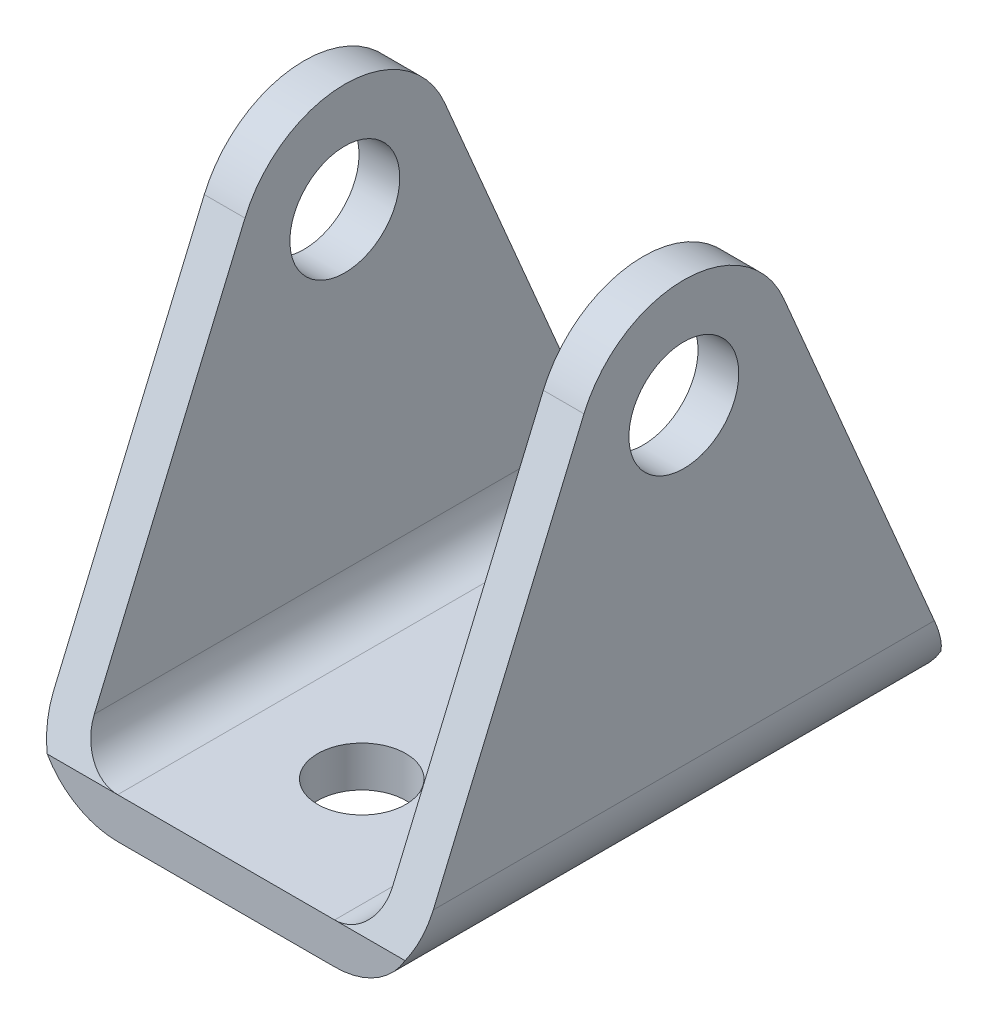
ISO-10303-21;
HEADER;
FILE_DESCRIPTION(('STEP AP214'),'2;1');
FILE_NAME('part.step','',(''),(''),'','','');
FILE_SCHEMA(('AUTOMOTIVE_DESIGN { 1 0 10303 214 1 1 1 1 }'));
ENDSEC;
DATA;
#1=APPLICATION_CONTEXT('core data for automotive mechanical design processes');
#2=APPLICATION_PROTOCOL_DEFINITION('international standard','automotive_design',2000,#1);
#3=PRODUCT_CONTEXT('',#1,'mechanical');
#4=PRODUCT('Part','Part','',(#3));
#5=PRODUCT_RELATED_PRODUCT_CATEGORY('part','',(#4));
#6=PRODUCT_DEFINITION_FORMATION('','',#4);
#7=PRODUCT_DEFINITION_CONTEXT('part definition',#1,'design');
#8=PRODUCT_DEFINITION('design','',#6,#7);
#9=PRODUCT_DEFINITION_SHAPE('','',#8);
#10=(LENGTH_UNIT() NAMED_UNIT(*) SI_UNIT(.MILLI.,.METRE.));
#11=(NAMED_UNIT(*) PLANE_ANGLE_UNIT() SI_UNIT($,.RADIAN.));
#12=(NAMED_UNIT(*) SI_UNIT($,.STERADIAN.) SOLID_ANGLE_UNIT());
#13=UNCERTAINTY_MEASURE_WITH_UNIT(LENGTH_MEASURE(1.E-05),#10,'distance_accuracy_value','');
#14=(GEOMETRIC_REPRESENTATION_CONTEXT(3) GLOBAL_UNCERTAINTY_ASSIGNED_CONTEXT((#13)) GLOBAL_UNIT_ASSIGNED_CONTEXT((#10,
#11,#12)) REPRESENTATION_CONTEXT('',''));
#15=CARTESIAN_POINT('',(0.,0.,0.));
#16=DIRECTION('',(0.,0.,1.));
#17=DIRECTION('',(1.,0.,0.));
#18=AXIS2_PLACEMENT_3D('',#15,#16,#17);
#19=CARTESIAN_POINT('',(-4.25,3.,-18.75));
#20=DIRECTION('',(0.,1.,0.));
#21=DIRECTION('',(0.,0.,1.));
#22=AXIS2_PLACEMENT_3D('',#19,#20,#21);
#23=PLANE('',#22);
#24=DIRECTION('',(1.,0.,0.));
#25=VECTOR('',#24,1.);
#26=CARTESIAN_POINT('',(-11.,3.,19.75));
#27=LINE('',#26,#25);
#28=CARTESIAN_POINT('',(-8.,3.,19.75));
#29=VERTEX_POINT('',#28);
#30=CARTESIAN_POINT('',(7.99999999999999,3.,19.75));
#31=VERTEX_POINT('',#30);
#32=EDGE_CURVE('E222',#29,#31,#27,.T.);
#33=ORIENTED_EDGE('',*,*,#32,.T.);
#34=DIRECTION('',(0.,0.,-1.));
#35=VECTOR('',#34,1.);
#36=CARTESIAN_POINT('',(8.,3.,-18.75));
#37=LINE('',#36,#35);
#38=CARTESIAN_POINT('',(8.,3.,-19.75));
#39=VERTEX_POINT('',#38);
#40=EDGE_CURVE('E129',#31,#39,#37,.T.);
#41=ORIENTED_EDGE('',*,*,#40,.T.);
#42=DIRECTION('',(-1.,0.,0.));
#43=VECTOR('',#42,1.);
#44=CARTESIAN_POINT('',(4.25000000000001,3.,-19.75));
#45=LINE('',#44,#43);
#46=CARTESIAN_POINT('',(4.25,3.,-19.75));
#47=VERTEX_POINT('',#46);
#48=EDGE_CURVE('E201',#39,#47,#45,.T.);
#49=ORIENTED_EDGE('',*,*,#48,.T.);
#50=CARTESIAN_POINT('',(4.25,3.,-18.75));
#51=DIRECTION('',(0.,1.,0.));
#52=DIRECTION('',(0.,0.,-1.));
#53=AXIS2_PLACEMENT_3D('',#50,#51,#52);
#54=CIRCLE('',#53,1.);
#55=CARTESIAN_POINT('',(3.25,3.,-18.75));
#56=VERTEX_POINT('',#55);
#57=EDGE_CURVE('E204',#47,#56,#54,.T.);
#58=ORIENTED_EDGE('',*,*,#57,.T.);
#59=DIRECTION('',(0.,0.,1.));
#60=VECTOR('',#59,1.);
#61=CARTESIAN_POINT('',(3.25,3.,-12.25));
#62=LINE('',#61,#60);
#63=CARTESIAN_POINT('',(3.25,3.,-12.25));
#64=VERTEX_POINT('',#63);
#65=EDGE_CURVE('E208',#56,#64,#62,.T.);
#66=ORIENTED_EDGE('',*,*,#65,.T.);
#67=CARTESIAN_POINT('',(0.,3.,-12.25));
#68=DIRECTION('',(0.,-1.,0.));
#69=DIRECTION('',(0.,0.,1.));
#70=AXIS2_PLACEMENT_3D('',#67,#68,#69);
#71=CIRCLE('',#70,3.25);
#72=CARTESIAN_POINT('',(-3.25,3.,-12.25));
#73=VERTEX_POINT('',#72);
#74=EDGE_CURVE('E211',#64,#73,#71,.T.);
#75=ORIENTED_EDGE('',*,*,#74,.T.);
#76=DIRECTION('',(0.,0.,-1.));
#77=VECTOR('',#76,1.);
#78=CARTESIAN_POINT('',(-3.25,3.,-12.25));
#79=LINE('',#78,#77);
#80=CARTESIAN_POINT('',(-3.25,3.,-18.75));
#81=VERTEX_POINT('',#80);
#82=EDGE_CURVE('E214',#73,#81,#79,.T.);
#83=ORIENTED_EDGE('',*,*,#82,.T.);
#84=CARTESIAN_POINT('',(-4.25,3.,-18.75));
#85=DIRECTION('',(0.,1.,0.));
#86=DIRECTION('',(0.,0.,1.));
#87=AXIS2_PLACEMENT_3D('',#84,#85,#86);
#88=CIRCLE('',#87,1.);
#89=CARTESIAN_POINT('',(-4.25,3.,-19.75));
#90=VERTEX_POINT('',#89);
#91=EDGE_CURVE('E217',#81,#90,#88,.T.);
#92=ORIENTED_EDGE('',*,*,#91,.T.);
#93=DIRECTION('',(-1.,0.,0.));
#94=VECTOR('',#93,1.);
#95=CARTESIAN_POINT('',(-11.,3.,-19.75));
#96=LINE('',#95,#94);
#97=CARTESIAN_POINT('',(-8.,3.,-19.75));
#98=VERTEX_POINT('',#97);
#99=EDGE_CURVE('E220',#90,#98,#96,.T.);
#100=ORIENTED_EDGE('',*,*,#99,.T.);
#101=DIRECTION('',(0.,0.,1.));
#102=VECTOR('',#101,1.);
#103=CARTESIAN_POINT('',(-8.,3.,-18.75));
#104=LINE('',#103,#102);
#105=EDGE_CURVE('E127',#98,#29,#104,.T.);
#106=ORIENTED_EDGE('',*,*,#105,.T.);
#107=EDGE_LOOP('',(#33,#41,#49,#58,#66,#75,#83,#92,#100,#106));
#108=FACE_BOUND('',#107,.T.);
#109=CARTESIAN_POINT('',(0.,3.,9.75));
#110=DIRECTION('',(0.,1.,0.));
#111=DIRECTION('',(0.,0.,1.));
#112=AXIS2_PLACEMENT_3D('',#109,#110,#111);
#113=CIRCLE('',#112,3.25);
#114=CARTESIAN_POINT('',(0.,3.,13.));
#115=VERTEX_POINT('',#114);
#116=EDGE_CURVE('E195',#115,#115,#113,.T.);
#117=ORIENTED_EDGE('',*,*,#116,.F.);
#118=EDGE_LOOP('',(#117));
#119=FACE_BOUND('',#118,.T.);
#120=ADVANCED_FACE('F35',(#108,#119),#23,.T.);
#121=CARTESIAN_POINT('',(-4.25,0.,-18.75));
#122=DIRECTION('',(0.,1.,0.));
#123=DIRECTION('',(0.,0.,1.));
#124=AXIS2_PLACEMENT_3D('',#121,#122,#123);
#125=PLANE('',#124);
#126=DIRECTION('',(1.,0.,0.));
#127=VECTOR('',#126,1.);
#128=CARTESIAN_POINT('',(-11.,0.,19.75));
#129=LINE('',#128,#127);
#130=CARTESIAN_POINT('',(-8.,0.,19.75));
#131=VERTEX_POINT('',#130);
#132=CARTESIAN_POINT('',(8.,0.,19.75));
#133=VERTEX_POINT('',#132);
#134=EDGE_CURVE('E205',#131,#133,#129,.T.);
#135=ORIENTED_EDGE('',*,*,#134,.F.);
#136=DIRECTION('',(0.,0.,-1.));
#137=VECTOR('',#136,1.);
#138=CARTESIAN_POINT('',(-8.,0.,-19.75));
#139=LINE('',#138,#137);
#140=CARTESIAN_POINT('',(-8.,0.,-19.75));
#141=VERTEX_POINT('',#140);
#142=EDGE_CURVE('E267',#131,#141,#139,.T.);
#143=ORIENTED_EDGE('',*,*,#142,.T.);
#144=DIRECTION('',(-1.,0.,0.));
#145=VECTOR('',#144,1.);
#146=CARTESIAN_POINT('',(-11.,0.,-19.75));
#147=LINE('',#146,#145);
#148=CARTESIAN_POINT('',(-4.25,0.,-19.75));
#149=VERTEX_POINT('',#148);
#150=EDGE_CURVE('E242',#149,#141,#147,.T.);
#151=ORIENTED_EDGE('',*,*,#150,.F.);
#152=CARTESIAN_POINT('',(-4.25,0.,-18.75));
#153=DIRECTION('',(0.,1.,0.));
#154=DIRECTION('',(0.,0.,1.));
#155=AXIS2_PLACEMENT_3D('',#152,#153,#154);
#156=CIRCLE('',#155,1.);
#157=CARTESIAN_POINT('',(-3.25,0.,-18.75));
#158=VERTEX_POINT('',#157);
#159=EDGE_CURVE('E239',#158,#149,#156,.T.);
#160=ORIENTED_EDGE('',*,*,#159,.F.);
#161=DIRECTION('',(0.,0.,-1.));
#162=VECTOR('',#161,1.);
#163=CARTESIAN_POINT('',(-3.25,0.,-12.25));
#164=LINE('',#163,#162);
#165=CARTESIAN_POINT('',(-3.25,0.,-12.25));
#166=VERTEX_POINT('',#165);
#167=EDGE_CURVE('E236',#166,#158,#164,.T.);
#168=ORIENTED_EDGE('',*,*,#167,.F.);
#169=CARTESIAN_POINT('',(0.,0.,-12.25));
#170=DIRECTION('',(0.,-1.,0.));
#171=DIRECTION('',(0.,0.,1.));
#172=AXIS2_PLACEMENT_3D('',#169,#170,#171);
#173=CIRCLE('',#172,3.25);
#174=CARTESIAN_POINT('',(3.25,0.,-12.25));
#175=VERTEX_POINT('',#174);
#176=EDGE_CURVE('E233',#175,#166,#173,.T.);
#177=ORIENTED_EDGE('',*,*,#176,.F.);
#178=DIRECTION('',(0.,0.,1.));
#179=VECTOR('',#178,1.);
#180=CARTESIAN_POINT('',(3.25,0.,-12.25));
#181=LINE('',#180,#179);
#182=CARTESIAN_POINT('',(3.25,0.,-18.75));
#183=VERTEX_POINT('',#182);
#184=EDGE_CURVE('E230',#183,#175,#181,.T.);
#185=ORIENTED_EDGE('',*,*,#184,.F.);
#186=CARTESIAN_POINT('',(4.25,0.,-18.75));
#187=DIRECTION('',(0.,1.,0.));
#188=DIRECTION('',(0.,0.,-1.));
#189=AXIS2_PLACEMENT_3D('',#186,#187,#188);
#190=CIRCLE('',#189,1.);
#191=CARTESIAN_POINT('',(4.25,0.,-19.75));
#192=VERTEX_POINT('',#191);
#193=EDGE_CURVE('E227',#192,#183,#190,.T.);
#194=ORIENTED_EDGE('',*,*,#193,.F.);
#195=DIRECTION('',(-1.,0.,0.));
#196=VECTOR('',#195,1.);
#197=CARTESIAN_POINT('',(4.25000000000001,0.,-19.75));
#198=LINE('',#197,#196);
#199=CARTESIAN_POINT('',(8.,0.,-19.75));
#200=VERTEX_POINT('',#199);
#201=EDGE_CURVE('E198',#200,#192,#198,.T.);
#202=ORIENTED_EDGE('',*,*,#201,.F.);
#203=DIRECTION('',(0.,0.,-1.));
#204=VECTOR('',#203,1.);
#205=CARTESIAN_POINT('',(8.,0.,19.75));
#206=LINE('',#205,#204);
#207=EDGE_CURVE('E264',#200,#133,#206,.F.);
#208=ORIENTED_EDGE('',*,*,#207,.T.);
#209=EDGE_LOOP('',(#135,#143,#151,#160,#168,#177,#185,#194,#202,#208));
#210=FACE_BOUND('',#209,.T.);
#211=CARTESIAN_POINT('',(0.,0.,9.75));
#212=DIRECTION('',(0.,1.,0.));
#213=DIRECTION('',(0.,0.,1.));
#214=AXIS2_PLACEMENT_3D('',#211,#212,#213);
#215=CIRCLE('',#214,3.25);
#216=CARTESIAN_POINT('',(0.,0.,13.));
#217=VERTEX_POINT('',#216);
#218=EDGE_CURVE('E194',#217,#217,#215,.T.);
#219=ORIENTED_EDGE('',*,*,#218,.T.);
#220=EDGE_LOOP('',(#219));
#221=FACE_BOUND('',#220,.T.);
#222=ADVANCED_FACE('F305',(#210,#221),#125,.F.);
#223=CARTESIAN_POINT('',(4.25000000000001,3.,-19.75));
#224=DIRECTION('',(0.,0.,1.));
#225=DIRECTION('',(1.,0.,0.));
#226=AXIS2_PLACEMENT_3D('',#223,#224,#225);
#227=PLANE('',#226);
#228=DIRECTION('',(-1.,0.,0.));
#229=VECTOR('',#228,1.);
#230=CARTESIAN_POINT('',(14.,3.,-19.75));
#231=LINE('',#230,#229);
#232=CARTESIAN_POINT('',(13.1961524227066,3.,-19.75));
#233=VERTEX_POINT('',#232);
#234=EDGE_CURVE('E83',#233,#39,#231,.T.);
#235=ORIENTED_EDGE('',*,*,#234,.F.);
#236=CARTESIAN_POINT('',(8.,6.,-19.75));
#237=DIRECTION('',(0.,0.,1.));
#238=DIRECTION('',(1.,0.,0.));
#239=AXIS2_PLACEMENT_3D('',#236,#237,#238);
#240=CIRCLE('',#239,6.);
#241=EDGE_CURVE('E134',#233,#200,#240,.F.);
#242=ORIENTED_EDGE('',*,*,#241,.T.);
#243=ORIENTED_EDGE('',*,*,#201,.T.);
#244=DIRECTION('',(0.,-1.,0.));
#245=VECTOR('',#244,1.);
#246=CARTESIAN_POINT('',(4.25,3.,-19.75));
#247=LINE('',#246,#245);
#248=EDGE_CURVE('E261',#47,#192,#247,.T.);
#249=ORIENTED_EDGE('',*,*,#248,.F.);
#250=ORIENTED_EDGE('',*,*,#48,.F.);
#251=EDGE_LOOP('',(#235,#242,#243,#249,#250));
#252=FACE_BOUND('',#251,.T.);
#253=ADVANCED_FACE('F293',(#252),#227,.F.);
#254=CARTESIAN_POINT('',(4.25,3.,-18.75));
#255=DIRECTION('',(0.,-1.,0.));
#256=DIRECTION('',(0.,0.,-1.));
#257=AXIS2_PLACEMENT_3D('',#254,#255,#256);
#258=CYLINDRICAL_SURFACE('',#257,1.);
#259=ORIENTED_EDGE('',*,*,#193,.T.);
#260=DIRECTION('',(0.,-1.,0.));
#261=VECTOR('',#260,1.);
#262=CARTESIAN_POINT('',(3.25,3.,-18.75));
#263=LINE('',#262,#261);
#264=EDGE_CURVE('E258',#56,#183,#263,.T.);
#265=ORIENTED_EDGE('',*,*,#264,.F.);
#266=ORIENTED_EDGE('',*,*,#57,.F.);
#267=ORIENTED_EDGE('',*,*,#248,.T.);
#268=EDGE_LOOP('',(#259,#265,#266,#267));
#269=FACE_BOUND('',#268,.T.);
#270=ADVANCED_FACE('F335',(#269),#258,.T.);
#271=CARTESIAN_POINT('',(3.25,3.,-12.25));
#272=DIRECTION('',(1.,0.,0.));
#273=DIRECTION('',(0.,0.,-1.));
#274=AXIS2_PLACEMENT_3D('',#271,#272,#273);
#275=PLANE('',#274);
#276=ORIENTED_EDGE('',*,*,#184,.T.);
#277=DIRECTION('',(0.,-1.,0.));
#278=VECTOR('',#277,1.);
#279=CARTESIAN_POINT('',(3.25,3.,-12.25));
#280=LINE('',#279,#278);
#281=EDGE_CURVE('E255',#64,#175,#280,.T.);
#282=ORIENTED_EDGE('',*,*,#281,.F.);
#283=ORIENTED_EDGE('',*,*,#65,.F.);
#284=ORIENTED_EDGE('',*,*,#264,.T.);
#285=EDGE_LOOP('',(#276,#282,#283,#284));
#286=FACE_BOUND('',#285,.T.);
#287=ADVANCED_FACE('F485',(#286),#275,.F.);
#288=CARTESIAN_POINT('',(0.,3.,-12.25));
#289=DIRECTION('',(0.,-1.,0.));
#290=DIRECTION('',(0.,0.,-1.));
#291=AXIS2_PLACEMENT_3D('',#288,#289,#290);
#292=CYLINDRICAL_SURFACE('',#291,3.25);
#293=ORIENTED_EDGE('',*,*,#176,.T.);
#294=DIRECTION('',(0.,-1.,0.));
#295=VECTOR('',#294,1.);
#296=CARTESIAN_POINT('',(-3.25,3.,-12.25));
#297=LINE('',#296,#295);
#298=EDGE_CURVE('E252',#73,#166,#297,.T.);
#299=ORIENTED_EDGE('',*,*,#298,.F.);
#300=ORIENTED_EDGE('',*,*,#74,.F.);
#301=ORIENTED_EDGE('',*,*,#281,.T.);
#302=EDGE_LOOP('',(#293,#299,#300,#301));
#303=FACE_BOUND('',#302,.T.);
#304=ADVANCED_FACE('F481',(#303),#292,.F.);
#305=CARTESIAN_POINT('',(-3.25,3.,-12.25));
#306=DIRECTION('',(-1.,0.,0.));
#307=DIRECTION('',(0.,0.,1.));
#308=AXIS2_PLACEMENT_3D('',#305,#306,#307);
#309=PLANE('',#308);
#310=ORIENTED_EDGE('',*,*,#167,.T.);
#311=DIRECTION('',(0.,-1.,0.));
#312=VECTOR('',#311,1.);
#313=CARTESIAN_POINT('',(-3.25,3.,-18.75));
#314=LINE('',#313,#312);
#315=EDGE_CURVE('E249',#81,#158,#314,.T.);
#316=ORIENTED_EDGE('',*,*,#315,.F.);
#317=ORIENTED_EDGE('',*,*,#82,.F.);
#318=ORIENTED_EDGE('',*,*,#298,.T.);
#319=EDGE_LOOP('',(#310,#316,#317,#318));
#320=FACE_BOUND('',#319,.T.);
#321=ADVANCED_FACE('F406',(#320),#309,.F.);
#322=CARTESIAN_POINT('',(-4.25,3.,-18.75));
#323=DIRECTION('',(0.,-1.,0.));
#324=DIRECTION('',(0.,0.,-1.));
#325=AXIS2_PLACEMENT_3D('',#322,#323,#324);
#326=CYLINDRICAL_SURFACE('',#325,1.);
#327=ORIENTED_EDGE('',*,*,#159,.T.);
#328=DIRECTION('',(0.,-1.,0.));
#329=VECTOR('',#328,1.);
#330=CARTESIAN_POINT('',(-4.25,3.,-19.75));
#331=LINE('',#330,#329);
#332=EDGE_CURVE('E224',#90,#149,#331,.T.);
#333=ORIENTED_EDGE('',*,*,#332,.F.);
#334=ORIENTED_EDGE('',*,*,#91,.F.);
#335=ORIENTED_EDGE('',*,*,#315,.T.);
#336=EDGE_LOOP('',(#327,#333,#334,#335));
#337=FACE_BOUND('',#336,.T.);
#338=ADVANCED_FACE('F394',(#337),#326,.T.);
#339=CARTESIAN_POINT('',(-11.,3.,-19.75));
#340=DIRECTION('',(0.,0.,1.));
#341=DIRECTION('',(1.,0.,0.));
#342=AXIS2_PLACEMENT_3D('',#339,#340,#341);
#343=PLANE('',#342);
#344=ORIENTED_EDGE('',*,*,#150,.T.);
#345=CARTESIAN_POINT('',(-8.,6.,-19.75));
#346=DIRECTION('',(0.,0.,1.));
#347=DIRECTION('',(1.,0.,0.));
#348=AXIS2_PLACEMENT_3D('',#345,#346,#347);
#349=CIRCLE('',#348,6.);
#350=CARTESIAN_POINT('',(-13.1961524227066,3.,-19.75));
#351=VERTEX_POINT('',#350);
#352=EDGE_CURVE('E270',#141,#351,#349,.F.);
#353=ORIENTED_EDGE('',*,*,#352,.T.);
#354=DIRECTION('',(1.,0.,0.));
#355=VECTOR('',#354,1.);
#356=CARTESIAN_POINT('',(-14.,3.,-19.75));
#357=LINE('',#356,#355);
#358=EDGE_CURVE('E50',#351,#98,#357,.T.);
#359=ORIENTED_EDGE('',*,*,#358,.T.);
#360=ORIENTED_EDGE('',*,*,#99,.F.);
#361=ORIENTED_EDGE('',*,*,#332,.T.);
#362=EDGE_LOOP('',(#344,#353,#359,#360,#361));
#363=FACE_BOUND('',#362,.T.);
#364=ADVANCED_FACE('F397',(#363),#343,.F.);
#365=CARTESIAN_POINT('',(-11.,3.,19.75));
#366=DIRECTION('',(0.,0.,-1.));
#367=DIRECTION('',(-1.,0.,0.));
#368=AXIS2_PLACEMENT_3D('',#365,#366,#367);
#369=PLANE('',#368);
#370=DIRECTION('',(1.,0.,0.));
#371=VECTOR('',#370,1.);
#372=CARTESIAN_POINT('',(-14.,3.,19.75));
#373=LINE('',#372,#371);
#374=CARTESIAN_POINT('',(-13.1961524227066,3.,19.75));
#375=VERTEX_POINT('',#374);
#376=EDGE_CURVE('E72',#375,#29,#373,.T.);
#377=ORIENTED_EDGE('',*,*,#376,.F.);
#378=CARTESIAN_POINT('',(-8.,6.,19.75));
#379=DIRECTION('',(0.,0.,-1.));
#380=DIRECTION('',(-1.,0.,0.));
#381=AXIS2_PLACEMENT_3D('',#378,#379,#380);
#382=CIRCLE('',#381,6.);
#383=EDGE_CURVE('E282',#375,#131,#382,.F.);
#384=ORIENTED_EDGE('',*,*,#383,.T.);
#385=ORIENTED_EDGE('',*,*,#134,.T.);
#386=CARTESIAN_POINT('',(8.,6.,19.75));
#387=DIRECTION('',(0.,0.,-1.));
#388=DIRECTION('',(-1.,0.,0.));
#389=AXIS2_PLACEMENT_3D('',#386,#387,#388);
#390=CIRCLE('',#389,6.);
#391=CARTESIAN_POINT('',(13.1961524227066,3.,19.75));
#392=VERTEX_POINT('',#391);
#393=EDGE_CURVE('E280',#133,#392,#390,.F.);
#394=ORIENTED_EDGE('',*,*,#393,.T.);
#395=DIRECTION('',(-1.,0.,0.));
#396=VECTOR('',#395,1.);
#397=CARTESIAN_POINT('',(14.,3.,19.75));
#398=LINE('',#397,#396);
#399=EDGE_CURVE('E59',#392,#31,#398,.T.);
#400=ORIENTED_EDGE('',*,*,#399,.T.);
#401=ORIENTED_EDGE('',*,*,#32,.F.);
#402=EDGE_LOOP('',(#377,#384,#385,#394,#400,#401));
#403=FACE_BOUND('',#402,.T.);
#404=ADVANCED_FACE('F316',(#403),#369,.F.);
#405=CARTESIAN_POINT('',(0.,3.,9.75));
#406=DIRECTION('',(0.,-1.,0.));
#407=DIRECTION('',(0.,0.,-1.));
#408=AXIS2_PLACEMENT_3D('',#405,#406,#407);
#409=CYLINDRICAL_SURFACE('',#408,3.25);
#410=ORIENTED_EDGE('',*,*,#116,.T.);
#411=EDGE_LOOP('',(#410));
#412=FACE_BOUND('',#411,.T.);
#413=ORIENTED_EDGE('',*,*,#218,.F.);
#414=EDGE_LOOP('',(#413));
#415=FACE_BOUND('',#414,.T.);
#416=ADVANCED_FACE('F404',(#412,#415),#409,.F.);
#417=CARTESIAN_POINT('',(14.,29.,0.));
#418=DIRECTION('',(1.,0.,0.));
#419=DIRECTION('',(0.,0.,-1.));
#420=AXIS2_PLACEMENT_3D('',#417,#418,#419);
#421=PLANE('',#420);
#422=DIRECTION('',(0.,-0.920245896090165,0.391340632606952));
#423=VECTOR('',#422,1.);
#424=CARTESIAN_POINT('',(14.,3.,19.75));
#425=LINE('',#424,#423);
#426=CARTESIAN_POINT('',(14.,32.1307250608556,7.36196716872131));
#427=VERTEX_POINT('',#426);
#428=CARTESIAN_POINT('',(14.,6.,18.4742302271503));
#429=VERTEX_POINT('',#428);
#430=EDGE_CURVE('E176',#427,#429,#425,.T.);
#431=ORIENTED_EDGE('',*,*,#430,.T.);
#432=DIRECTION('',(0.,0.,-1.));
#433=VECTOR('',#432,1.);
#434=CARTESIAN_POINT('',(14.,6.,-19.75));
#435=LINE('',#434,#433);
#436=CARTESIAN_POINT('',(14.,6.,-18.4742302271503));
#437=VERTEX_POINT('',#436);
#438=EDGE_CURVE('E285',#429,#437,#435,.T.);
#439=ORIENTED_EDGE('',*,*,#438,.T.);
#440=DIRECTION('',(0.,0.920245896090165,0.391340632606952));
#441=VECTOR('',#440,1.);
#442=CARTESIAN_POINT('',(14.,3.,-19.75));
#443=LINE('',#442,#441);
#444=CARTESIAN_POINT('',(14.,32.1307250608556,-7.36196716872132));
#445=VERTEX_POINT('',#444);
#446=EDGE_CURVE('E169',#437,#445,#443,.T.);
#447=ORIENTED_EDGE('',*,*,#446,.T.);
#448=CARTESIAN_POINT('',(14.,29.,0.));
#449=DIRECTION('',(1.,0.,0.));
#450=DIRECTION('',(0.,0.,-1.));
#451=AXIS2_PLACEMENT_3D('',#448,#449,#450);
#452=CIRCLE('',#451,8.);
#453=EDGE_CURVE('E172',#445,#427,#452,.T.);
#454=ORIENTED_EDGE('',*,*,#453,.T.);
#455=EDGE_LOOP('',(#431,#439,#447,#454));
#456=FACE_BOUND('',#455,.T.);
#457=CARTESIAN_POINT('',(14.,29.,0.));
#458=DIRECTION('',(1.,0.,0.));
#459=DIRECTION('',(0.,0.,-1.));
#460=AXIS2_PLACEMENT_3D('',#457,#458,#459);
#461=CIRCLE('',#460,4.05);
#462=CARTESIAN_POINT('',(14.,29.,-4.05));
#463=VERTEX_POINT('',#462);
#464=EDGE_CURVE('E163',#463,#463,#461,.T.);
#465=ORIENTED_EDGE('',*,*,#464,.F.);
#466=EDGE_LOOP('',(#465));
#467=FACE_BOUND('',#466,.T.);
#468=ADVANCED_FACE('F363',(#456,#467),#421,.T.);
#469=CARTESIAN_POINT('',(11.,29.,0.));
#470=DIRECTION('',(1.,0.,0.));
#471=DIRECTION('',(0.,0.,-1.));
#472=AXIS2_PLACEMENT_3D('',#469,#470,#471);
#473=PLANE('',#472);
#474=DIRECTION('',(0.,0.920245896090165,0.391340632606952));
#475=VECTOR('',#474,1.);
#476=CARTESIAN_POINT('',(11.,3.,-19.75));
#477=LINE('',#476,#475);
#478=CARTESIAN_POINT('',(11.,6.,-18.4742302271503));
#479=VERTEX_POINT('',#478);
#480=CARTESIAN_POINT('',(11.,32.1307250608556,-7.36196716872132));
#481=VERTEX_POINT('',#480);
#482=EDGE_CURVE('E166',#479,#481,#477,.T.);
#483=ORIENTED_EDGE('',*,*,#482,.F.);
#484=DIRECTION('',(0.,0.,-1.));
#485=VECTOR('',#484,1.);
#486=CARTESIAN_POINT('',(11.,6.,0.));
#487=LINE('',#486,#485);
#488=CARTESIAN_POINT('',(11.,6.,18.4742302271503));
#489=VERTEX_POINT('',#488);
#490=EDGE_CURVE('E114',#479,#489,#487,.F.);
#491=ORIENTED_EDGE('',*,*,#490,.T.);
#492=DIRECTION('',(0.,-0.920245896090165,0.391340632606952));
#493=VECTOR('',#492,1.);
#494=CARTESIAN_POINT('',(11.,3.,19.75));
#495=LINE('',#494,#493);
#496=CARTESIAN_POINT('',(11.,32.1307250608556,7.36196716872131));
#497=VERTEX_POINT('',#496);
#498=EDGE_CURVE('E173',#497,#489,#495,.T.);
#499=ORIENTED_EDGE('',*,*,#498,.F.);
#500=CARTESIAN_POINT('',(11.,29.,0.));
#501=DIRECTION('',(1.,0.,0.));
#502=DIRECTION('',(0.,0.,-1.));
#503=AXIS2_PLACEMENT_3D('',#500,#501,#502);
#504=CIRCLE('',#503,8.);
#505=EDGE_CURVE('E181',#481,#497,#504,.T.);
#506=ORIENTED_EDGE('',*,*,#505,.F.);
#507=EDGE_LOOP('',(#483,#491,#499,#506));
#508=FACE_BOUND('',#507,.T.);
#509=CARTESIAN_POINT('',(11.,29.,0.));
#510=DIRECTION('',(1.,0.,0.));
#511=DIRECTION('',(0.,0.,-1.));
#512=AXIS2_PLACEMENT_3D('',#509,#510,#511);
#513=CIRCLE('',#512,4.05);
#514=CARTESIAN_POINT('',(11.,29.,-4.05));
#515=VERTEX_POINT('',#514);
#516=EDGE_CURVE('E162',#515,#515,#513,.T.);
#517=ORIENTED_EDGE('',*,*,#516,.T.);
#518=EDGE_LOOP('',(#517));
#519=FACE_BOUND('',#518,.T.);
#520=ADVANCED_FACE('F378',(#508,#519),#473,.F.);
#521=CARTESIAN_POINT('',(14.,3.,-19.75));
#522=DIRECTION('',(0.,-0.391340632606952,0.920245896090165));
#523=DIRECTION('',(0.,-0.920245896090165,-0.391340632606952));
#524=AXIS2_PLACEMENT_3D('',#521,#522,#523);
#525=PLANE('',#524);
#526=ORIENTED_EDGE('',*,*,#446,.F.);
#527=CARTESIAN_POINT('',(8.,6.,-18.4742302271503));
#528=DIRECTION('',(0.,-0.391340632606952,0.920245896090165));
#529=DIRECTION('',(0.,0.920245896090165,0.391340632606952));
#530=AXIS2_PLACEMENT_3D('',#527,#528,#529);
#531=ELLIPSE('',#530,6.51999647647668,6.);
#532=EDGE_CURVE('E89',#437,#233,#531,.F.);
#533=ORIENTED_EDGE('',*,*,#532,.T.);
#534=ORIENTED_EDGE('',*,*,#234,.T.);
#535=CARTESIAN_POINT('',(8.,6.,-18.4742302271503));
#536=DIRECTION('',(0.,-0.391340632606952,0.920245896090165));
#537=DIRECTION('',(0.,-0.920245896090165,-0.391340632606952));
#538=AXIS2_PLACEMENT_3D('',#535,#536,#537);
#539=ELLIPSE('',#538,3.25999823823834,3.);
#540=EDGE_CURVE('E113',#39,#479,#539,.T.);
#541=ORIENTED_EDGE('',*,*,#540,.T.);
#542=ORIENTED_EDGE('',*,*,#482,.T.);
#543=DIRECTION('',(-1.,0.,0.));
#544=VECTOR('',#543,1.);
#545=CARTESIAN_POINT('',(14.,32.1307250608556,-7.36196716872132));
#546=LINE('',#545,#544);
#547=EDGE_CURVE('E190',#445,#481,#546,.T.);
#548=ORIENTED_EDGE('',*,*,#547,.F.);
#549=EDGE_LOOP('',(#526,#533,#534,#541,#542,#548));
#550=FACE_BOUND('',#549,.T.);
#551=ADVANCED_FACE('F366',(#550),#525,.F.);
#552=CARTESIAN_POINT('',(14.,29.,0.));
#553=DIRECTION('',(-1.,0.,0.));
#554=DIRECTION('',(0.,0.,1.));
#555=AXIS2_PLACEMENT_3D('',#552,#553,#554);
#556=CYLINDRICAL_SURFACE('',#555,8.);
#557=ORIENTED_EDGE('',*,*,#505,.T.);
#558=DIRECTION('',(-1.,0.,0.));
#559=VECTOR('',#558,1.);
#560=CARTESIAN_POINT('',(14.,32.1307250608556,7.36196716872131));
#561=LINE('',#560,#559);
#562=EDGE_CURVE('E187',#427,#497,#561,.T.);
#563=ORIENTED_EDGE('',*,*,#562,.F.);
#564=ORIENTED_EDGE('',*,*,#453,.F.);
#565=ORIENTED_EDGE('',*,*,#547,.T.);
#566=EDGE_LOOP('',(#557,#563,#564,#565));
#567=FACE_BOUND('',#566,.T.);
#568=ADVANCED_FACE('F375',(#567),#556,.T.);
#569=CARTESIAN_POINT('',(14.,3.,19.75));
#570=DIRECTION('',(0.,-0.391340632606952,-0.920245896090165));
#571=DIRECTION('',(0.,0.920245896090165,-0.391340632606952));
#572=AXIS2_PLACEMENT_3D('',#569,#570,#571);
#573=PLANE('',#572);
#574=ORIENTED_EDGE('',*,*,#399,.F.);
#575=CARTESIAN_POINT('',(8.,6.,18.4742302271503));
#576=DIRECTION('',(0.,-0.391340632606952,-0.920245896090165));
#577=DIRECTION('',(0.,-0.920245896090165,0.391340632606952));
#578=AXIS2_PLACEMENT_3D('',#575,#576,#577);
#579=ELLIPSE('',#578,6.51999647647668,6.);
#580=EDGE_CURVE('E130',#392,#429,#579,.F.);
#581=ORIENTED_EDGE('',*,*,#580,.T.);
#582=ORIENTED_EDGE('',*,*,#430,.F.);
#583=ORIENTED_EDGE('',*,*,#562,.T.);
#584=ORIENTED_EDGE('',*,*,#498,.T.);
#585=CARTESIAN_POINT('',(8.,6.,18.4742302271503));
#586=DIRECTION('',(0.,-0.391340632606952,-0.920245896090165));
#587=DIRECTION('',(0.,0.920245896090165,-0.391340632606952));
#588=AXIS2_PLACEMENT_3D('',#585,#586,#587);
#589=ELLIPSE('',#588,3.25999823823834,3.);
#590=EDGE_CURVE('E140',#489,#31,#589,.T.);
#591=ORIENTED_EDGE('',*,*,#590,.T.);
#592=EDGE_LOOP('',(#574,#581,#582,#583,#584,#591));
#593=FACE_BOUND('',#592,.T.);
#594=ADVANCED_FACE('F320',(#593),#573,.F.);
#595=CARTESIAN_POINT('',(14.,29.,0.));
#596=DIRECTION('',(-1.,0.,0.));
#597=DIRECTION('',(0.,0.,1.));
#598=AXIS2_PLACEMENT_3D('',#595,#596,#597);
#599=CYLINDRICAL_SURFACE('',#598,4.05);
#600=ORIENTED_EDGE('',*,*,#464,.T.);
#601=EDGE_LOOP('',(#600));
#602=FACE_BOUND('',#601,.T.);
#603=ORIENTED_EDGE('',*,*,#516,.F.);
#604=EDGE_LOOP('',(#603));
#605=FACE_BOUND('',#604,.T.);
#606=ADVANCED_FACE('F424',(#602,#605),#599,.F.);
#607=CARTESIAN_POINT('',(-14.,3.,19.75));
#608=DIRECTION('',(0.,0.391340632606952,0.920245896090165));
#609=DIRECTION('',(0.,-0.920245896090165,0.391340632606952));
#610=AXIS2_PLACEMENT_3D('',#607,#608,#609);
#611=PLANE('',#610);
#612=DIRECTION('',(0.,-0.920245896090165,0.391340632606952));
#613=VECTOR('',#612,1.);
#614=CARTESIAN_POINT('',(-14.,3.,19.75));
#615=LINE('',#614,#613);
#616=CARTESIAN_POINT('',(-14.,32.1307250608556,7.36196716872131));
#617=VERTEX_POINT('',#616);
#618=CARTESIAN_POINT('',(-14.,6.,18.4742302271503));
#619=VERTEX_POINT('',#618);
#620=EDGE_CURVE('E123',#617,#619,#615,.T.);
#621=ORIENTED_EDGE('',*,*,#620,.T.);
#622=CARTESIAN_POINT('',(-8.,6.,18.4742302271503));
#623=DIRECTION('',(0.,0.391340632606952,0.920245896090165));
#624=DIRECTION('',(0.,-0.920245896090165,0.391340632606952));
#625=AXIS2_PLACEMENT_3D('',#622,#623,#624);
#626=ELLIPSE('',#625,6.51999647647668,6.);
#627=EDGE_CURVE('E278',#619,#375,#626,.T.);
#628=ORIENTED_EDGE('',*,*,#627,.T.);
#629=ORIENTED_EDGE('',*,*,#376,.T.);
#630=CARTESIAN_POINT('',(-8.,6.,18.4742302271503));
#631=DIRECTION('',(0.,0.391340632606952,0.920245896090165));
#632=DIRECTION('',(0.,-0.920245896090165,0.391340632606952));
#633=AXIS2_PLACEMENT_3D('',#630,#631,#632);
#634=ELLIPSE('',#633,3.25999823823834,3.);
#635=CARTESIAN_POINT('',(-11.,6.,18.4742302271503));
#636=VERTEX_POINT('',#635);
#637=EDGE_CURVE('E43',#29,#636,#634,.F.);
#638=ORIENTED_EDGE('',*,*,#637,.T.);
#639=DIRECTION('',(0.,-0.920245896090165,0.391340632606952));
#640=VECTOR('',#639,1.);
#641=CARTESIAN_POINT('',(-11.,3.,19.75));
#642=LINE('',#641,#640);
#643=CARTESIAN_POINT('',(-11.,32.1307250608556,7.36196716872131));
#644=VERTEX_POINT('',#643);
#645=EDGE_CURVE('E110',#644,#636,#642,.T.);
#646=ORIENTED_EDGE('',*,*,#645,.F.);
#647=DIRECTION('',(1.,0.,0.));
#648=VECTOR('',#647,1.);
#649=CARTESIAN_POINT('',(-14.,32.1307250608556,7.36196716872131));
#650=LINE('',#649,#648);
#651=EDGE_CURVE('E148',#617,#644,#650,.T.);
#652=ORIENTED_EDGE('',*,*,#651,.F.);
#653=EDGE_LOOP('',(#621,#628,#629,#638,#646,#652));
#654=FACE_BOUND('',#653,.T.);
#655=ADVANCED_FACE('F143',(#654),#611,.T.);
#656=CARTESIAN_POINT('',(-14.,29.,0.));
#657=DIRECTION('',(1.,0.,0.));
#658=DIRECTION('',(0.,0.,-1.));
#659=AXIS2_PLACEMENT_3D('',#656,#657,#658);
#660=CYLINDRICAL_SURFACE('',#659,8.);
#661=CARTESIAN_POINT('',(-11.,29.,0.));
#662=DIRECTION('',(1.,0.,0.));
#663=DIRECTION('',(0.,0.,-1.));
#664=AXIS2_PLACEMENT_3D('',#661,#662,#663);
#665=CIRCLE('',#664,8.);
#666=CARTESIAN_POINT('',(-11.,32.1307250608556,-7.36196716872132));
#667=VERTEX_POINT('',#666);
#668=EDGE_CURVE('E124',#667,#644,#665,.T.);
#669=ORIENTED_EDGE('',*,*,#668,.F.);
#670=DIRECTION('',(1.,0.,0.));
#671=VECTOR('',#670,1.);
#672=CARTESIAN_POINT('',(-14.,32.1307250608556,-7.36196716872132));
#673=LINE('',#672,#671);
#674=CARTESIAN_POINT('',(-14.,32.1307250608556,-7.36196716872132));
#675=VERTEX_POINT('',#674);
#676=EDGE_CURVE('E121',#675,#667,#673,.T.);
#677=ORIENTED_EDGE('',*,*,#676,.F.);
#678=CARTESIAN_POINT('',(-14.,29.,0.));
#679=DIRECTION('',(1.,0.,0.));
#680=DIRECTION('',(0.,0.,-1.));
#681=AXIS2_PLACEMENT_3D('',#678,#679,#680);
#682=CIRCLE('',#681,8.);
#683=EDGE_CURVE('E464',#675,#617,#682,.T.);
#684=ORIENTED_EDGE('',*,*,#683,.T.);
#685=ORIENTED_EDGE('',*,*,#651,.T.);
#686=EDGE_LOOP('',(#669,#677,#684,#685));
#687=FACE_BOUND('',#686,.T.);
#688=ADVANCED_FACE('F434',(#687),#660,.T.);
#689=CARTESIAN_POINT('',(-14.,3.,-19.75));
#690=DIRECTION('',(0.,0.391340632606952,-0.920245896090165));
#691=DIRECTION('',(0.,0.920245896090165,0.391340632606952));
#692=AXIS2_PLACEMENT_3D('',#689,#690,#691);
#693=PLANE('',#692);
#694=ORIENTED_EDGE('',*,*,#358,.F.);
#695=CARTESIAN_POINT('',(-8.,6.,-18.4742302271503));
#696=DIRECTION('',(0.,0.391340632606952,-0.920245896090165));
#697=DIRECTION('',(0.,0.920245896090165,0.391340632606952));
#698=AXIS2_PLACEMENT_3D('',#695,#696,#697);
#699=ELLIPSE('',#698,6.51999647647668,6.);
#700=CARTESIAN_POINT('',(-14.,6.,-18.4742302271503));
#701=VERTEX_POINT('',#700);
#702=EDGE_CURVE('E272',#351,#701,#699,.T.);
#703=ORIENTED_EDGE('',*,*,#702,.T.);
#704=DIRECTION('',(0.,0.920245896090165,0.391340632606952));
#705=VECTOR('',#704,1.);
#706=CARTESIAN_POINT('',(-14.,3.,-19.75));
#707=LINE('',#706,#705);
#708=EDGE_CURVE('E158',#701,#675,#707,.T.);
#709=ORIENTED_EDGE('',*,*,#708,.T.);
#710=ORIENTED_EDGE('',*,*,#676,.T.);
#711=DIRECTION('',(0.,0.920245896090165,0.391340632606952));
#712=VECTOR('',#711,1.);
#713=CARTESIAN_POINT('',(-11.,3.,-19.75));
#714=LINE('',#713,#712);
#715=CARTESIAN_POINT('',(-11.,6.,-18.4742302271503));
#716=VERTEX_POINT('',#715);
#717=EDGE_CURVE('E107',#716,#667,#714,.T.);
#718=ORIENTED_EDGE('',*,*,#717,.F.);
#719=CARTESIAN_POINT('',(-8.,6.,-18.4742302271503));
#720=DIRECTION('',(0.,0.391340632606952,-0.920245896090165));
#721=DIRECTION('',(0.,0.920245896090165,0.391340632606952));
#722=AXIS2_PLACEMENT_3D('',#719,#720,#721);
#723=ELLIPSE('',#722,3.25999823823834,3.);
#724=EDGE_CURVE('E11',#716,#98,#723,.F.);
#725=ORIENTED_EDGE('',*,*,#724,.T.);
#726=EDGE_LOOP('',(#694,#703,#709,#710,#718,#725));
#727=FACE_BOUND('',#726,.T.);
#728=ADVANCED_FACE('F117',(#727),#693,.T.);
#729=CARTESIAN_POINT('',(-14.,29.,0.));
#730=DIRECTION('',(-1.,0.,0.));
#731=DIRECTION('',(0.,0.,-1.));
#732=AXIS2_PLACEMENT_3D('',#729,#730,#731);
#733=PLANE('',#732);
#734=CARTESIAN_POINT('',(-14.,29.,0.));
#735=DIRECTION('',(1.,0.,0.));
#736=DIRECTION('',(0.,0.,-1.));
#737=AXIS2_PLACEMENT_3D('',#734,#735,#736);
#738=CIRCLE('',#737,4.05);
#739=CARTESIAN_POINT('',(-14.,29.,-4.05));
#740=VERTEX_POINT('',#739);
#741=EDGE_CURVE('E151',#740,#740,#738,.T.);
#742=ORIENTED_EDGE('',*,*,#741,.T.);
#743=EDGE_LOOP('',(#742));
#744=FACE_BOUND('',#743,.T.);
#745=ORIENTED_EDGE('',*,*,#708,.F.);
#746=DIRECTION('',(0.,0.,-1.));
#747=VECTOR('',#746,1.);
#748=CARTESIAN_POINT('',(-14.,6.,19.75));
#749=LINE('',#748,#747);
#750=EDGE_CURVE('E275',#701,#619,#749,.F.);
#751=ORIENTED_EDGE('',*,*,#750,.T.);
#752=ORIENTED_EDGE('',*,*,#620,.F.);
#753=ORIENTED_EDGE('',*,*,#683,.F.);
#754=EDGE_LOOP('',(#745,#751,#752,#753));
#755=FACE_BOUND('',#754,.T.);
#756=ADVANCED_FACE('F439',(#744,#755),#733,.T.);
#757=CARTESIAN_POINT('',(-11.,29.,0.));
#758=DIRECTION('',(-1.,0.,0.));
#759=DIRECTION('',(0.,0.,-1.));
#760=AXIS2_PLACEMENT_3D('',#757,#758,#759);
#761=PLANE('',#760);
#762=ORIENTED_EDGE('',*,*,#645,.T.);
#763=DIRECTION('',(0.,0.,1.));
#764=VECTOR('',#763,1.);
#765=CARTESIAN_POINT('',(-11.,6.,0.));
#766=LINE('',#765,#764);
#767=EDGE_CURVE('E101',#636,#716,#766,.F.);
#768=ORIENTED_EDGE('',*,*,#767,.T.);
#769=ORIENTED_EDGE('',*,*,#717,.T.);
#770=ORIENTED_EDGE('',*,*,#668,.T.);
#771=EDGE_LOOP('',(#762,#768,#769,#770));
#772=FACE_BOUND('',#771,.T.);
#773=CARTESIAN_POINT('',(-11.,29.,0.));
#774=DIRECTION('',(1.,0.,0.));
#775=DIRECTION('',(0.,0.,-1.));
#776=AXIS2_PLACEMENT_3D('',#773,#774,#775);
#777=CIRCLE('',#776,4.05);
#778=CARTESIAN_POINT('',(-11.,29.,-4.05));
#779=VERTEX_POINT('',#778);
#780=EDGE_CURVE('E459',#779,#779,#777,.T.);
#781=ORIENTED_EDGE('',*,*,#780,.F.);
#782=EDGE_LOOP('',(#781));
#783=FACE_BOUND('',#782,.T.);
#784=ADVANCED_FACE('F103',(#772,#783),#761,.F.);
#785=CARTESIAN_POINT('',(-14.,29.,0.));
#786=DIRECTION('',(1.,0.,0.));
#787=DIRECTION('',(0.,0.,-1.));
#788=AXIS2_PLACEMENT_3D('',#785,#786,#787);
#789=CYLINDRICAL_SURFACE('',#788,4.05);
#790=ORIENTED_EDGE('',*,*,#741,.F.);
#791=EDGE_LOOP('',(#790));
#792=FACE_BOUND('',#791,.T.);
#793=ORIENTED_EDGE('',*,*,#780,.T.);
#794=EDGE_LOOP('',(#793));
#795=FACE_BOUND('',#794,.T.);
#796=ADVANCED_FACE('F442',(#792,#795),#789,.F.);
#797=CARTESIAN_POINT('',(-8.,6.,-18.75));
#798=DIRECTION('',(0.,0.,1.));
#799=DIRECTION('',(1.,0.,0.));
#800=AXIS2_PLACEMENT_3D('',#797,#798,#799);
#801=CYLINDRICAL_SURFACE('',#800,6.);
#802=ORIENTED_EDGE('',*,*,#627,.F.);
#803=ORIENTED_EDGE('',*,*,#750,.F.);
#804=ORIENTED_EDGE('',*,*,#702,.F.);
#805=ORIENTED_EDGE('',*,*,#352,.F.);
#806=ORIENTED_EDGE('',*,*,#142,.F.);
#807=ORIENTED_EDGE('',*,*,#383,.F.);
#808=EDGE_LOOP('',(#802,#803,#804,#805,#806,#807));
#809=FACE_BOUND('',#808,.T.);
#810=ADVANCED_FACE('F447',(#809),#801,.T.);
#811=CARTESIAN_POINT('',(8.,6.,0.));
#812=DIRECTION('',(0.,0.,1.));
#813=DIRECTION('',(1.,0.,0.));
#814=AXIS2_PLACEMENT_3D('',#811,#812,#813);
#815=CYLINDRICAL_SURFACE('',#814,6.);
#816=ORIENTED_EDGE('',*,*,#393,.F.);
#817=ORIENTED_EDGE('',*,*,#207,.F.);
#818=ORIENTED_EDGE('',*,*,#241,.F.);
#819=ORIENTED_EDGE('',*,*,#532,.F.);
#820=ORIENTED_EDGE('',*,*,#438,.F.);
#821=ORIENTED_EDGE('',*,*,#580,.F.);
#822=EDGE_LOOP('',(#816,#817,#818,#819,#820,#821));
#823=FACE_BOUND('',#822,.T.);
#824=ADVANCED_FACE('F310',(#823),#815,.T.);
#825=CARTESIAN_POINT('',(8.,6.,-18.75));
#826=DIRECTION('',(0.,0.,-1.));
#827=DIRECTION('',(-1.,0.,0.));
#828=AXIS2_PLACEMENT_3D('',#825,#826,#827);
#829=CYLINDRICAL_SURFACE('',#828,3.);
#830=ORIENTED_EDGE('',*,*,#590,.F.);
#831=ORIENTED_EDGE('',*,*,#490,.F.);
#832=ORIENTED_EDGE('',*,*,#540,.F.);
#833=ORIENTED_EDGE('',*,*,#40,.F.);
#834=EDGE_LOOP('',(#830,#831,#832,#833));
#835=FACE_BOUND('',#834,.T.);
#836=ADVANCED_FACE('F327',(#835),#829,.F.);
#837=CARTESIAN_POINT('',(-8.,6.,-18.75));
#838=DIRECTION('',(0.,0.,1.));
#839=DIRECTION('',(1.,0.,0.));
#840=AXIS2_PLACEMENT_3D('',#837,#838,#839);
#841=CYLINDRICAL_SURFACE('',#840,3.);
#842=ORIENTED_EDGE('',*,*,#724,.F.);
#843=ORIENTED_EDGE('',*,*,#767,.F.);
#844=ORIENTED_EDGE('',*,*,#637,.F.);
#845=ORIENTED_EDGE('',*,*,#105,.F.);
#846=EDGE_LOOP('',(#842,#843,#844,#845));
#847=FACE_BOUND('',#846,.T.);
#848=ADVANCED_FACE('F37',(#847),#841,.F.);
#849=CLOSED_SHELL('',(#120,#222,#253,#270,#287,#304,#321,#338,#364,#404,#416,#468,#520,#551,
#568,#594,#606,#655,#688,#728,#756,#784,#796,#810,#824,#836,#848));
#850=MANIFOLD_SOLID_BREP('B2',#849);
#851=ADVANCED_BREP_SHAPE_REPRESENTATION('',(#18,#850),#14);
#852=SHAPE_DEFINITION_REPRESENTATION(#9,#851);
ENDSEC;
END-ISO-10303-21;
